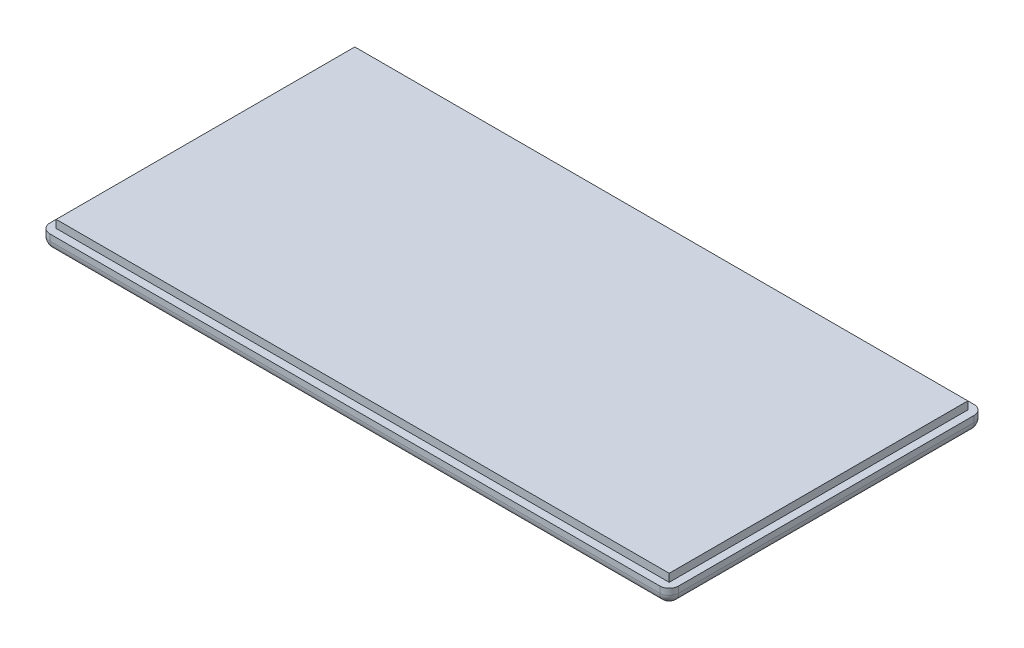
ISO-10303-21;
HEADER;
FILE_DESCRIPTION(('STEP AP214'),'2;1');
FILE_NAME('part.step','',(''),(''),'','','');
FILE_SCHEMA(('AUTOMOTIVE_DESIGN { 1 0 10303 214 1 1 1 1 }'));
ENDSEC;
DATA;
#1=APPLICATION_CONTEXT('core data for automotive mechanical design processes');
#2=APPLICATION_PROTOCOL_DEFINITION('international standard','automotive_design',2000,#1);
#3=PRODUCT_CONTEXT('',#1,'mechanical');
#4=PRODUCT('Part','Part','',(#3));
#5=PRODUCT_RELATED_PRODUCT_CATEGORY('part','',(#4));
#6=PRODUCT_DEFINITION_FORMATION('','',#4);
#7=PRODUCT_DEFINITION_CONTEXT('part definition',#1,'design');
#8=PRODUCT_DEFINITION('design','',#6,#7);
#9=PRODUCT_DEFINITION_SHAPE('','',#8);
#10=(LENGTH_UNIT() NAMED_UNIT(*) SI_UNIT(.MILLI.,.METRE.));
#11=(NAMED_UNIT(*) PLANE_ANGLE_UNIT() SI_UNIT($,.RADIAN.));
#12=(NAMED_UNIT(*) SI_UNIT($,.STERADIAN.) SOLID_ANGLE_UNIT());
#13=UNCERTAINTY_MEASURE_WITH_UNIT(LENGTH_MEASURE(1.E-05),#10,'distance_accuracy_value','');
#14=(GEOMETRIC_REPRESENTATION_CONTEXT(3) GLOBAL_UNCERTAINTY_ASSIGNED_CONTEXT((#13)) GLOBAL_UNIT_ASSIGNED_CONTEXT((#10,
#11,#12)) REPRESENTATION_CONTEXT('',''));
#15=CARTESIAN_POINT('',(0.,0.,0.));
#16=DIRECTION('',(0.,0.,1.));
#17=DIRECTION('',(1.,0.,0.));
#18=AXIS2_PLACEMENT_3D('',#15,#16,#17);
#19=CARTESIAN_POINT('',(0.,5.,0.));
#20=DIRECTION('',(1.,0.,0.));
#21=DIRECTION('',(0.,0.,-1.));
#22=AXIS2_PLACEMENT_3D('',#19,#20,#21);
#23=PLANE('',#22);
#24=DIRECTION('',(0.,-1.,0.));
#25=VECTOR('',#24,1.);
#26=CARTESIAN_POINT('',(0.,5.,3.));
#27=LINE('',#26,#25);
#28=CARTESIAN_POINT('',(0.,5.,3.));
#29=VERTEX_POINT('',#28);
#30=CARTESIAN_POINT('',(0.,3.,3.));
#31=VERTEX_POINT('',#30);
#32=EDGE_CURVE('E227',#29,#31,#27,.T.);
#33=ORIENTED_EDGE('',*,*,#32,.T.);
#34=DIRECTION('',(0.,0.,1.));
#35=VECTOR('',#34,1.);
#36=CARTESIAN_POINT('',(0.,3.,0.));
#37=LINE('',#36,#35);
#38=CARTESIAN_POINT('',(0.,3.,97.));
#39=VERTEX_POINT('',#38);
#40=EDGE_CURVE('E254',#31,#39,#37,.T.);
#41=ORIENTED_EDGE('',*,*,#40,.T.);
#42=DIRECTION('',(0.,-1.,0.));
#43=VECTOR('',#42,1.);
#44=CARTESIAN_POINT('',(0.,5.,97.));
#45=LINE('',#44,#43);
#46=CARTESIAN_POINT('',(0.,5.,97.));
#47=VERTEX_POINT('',#46);
#48=EDGE_CURVE('E224',#39,#47,#45,.F.);
#49=ORIENTED_EDGE('',*,*,#48,.T.);
#50=DIRECTION('',(0.,0.,1.));
#51=VECTOR('',#50,1.);
#52=CARTESIAN_POINT('',(0.,5.,0.));
#53=LINE('',#52,#51);
#54=EDGE_CURVE('E171',#29,#47,#53,.T.);
#55=ORIENTED_EDGE('',*,*,#54,.F.);
#56=EDGE_LOOP('',(#33,#41,#49,#55));
#57=FACE_BOUND('',#56,.T.);
#58=ADVANCED_FACE('F40',(#57),#23,.F.);
#59=CARTESIAN_POINT('',(0.,5.,100.));
#60=DIRECTION('',(0.,0.,-1.));
#61=DIRECTION('',(-1.,0.,0.));
#62=AXIS2_PLACEMENT_3D('',#59,#60,#61);
#63=PLANE('',#62);
#64=DIRECTION('',(0.,-1.,0.));
#65=VECTOR('',#64,1.);
#66=CARTESIAN_POINT('',(3.00000000000001,5.,100.));
#67=LINE('',#66,#65);
#68=CARTESIAN_POINT('',(3.00000000000001,5.,100.));
#69=VERTEX_POINT('',#68);
#70=CARTESIAN_POINT('',(3.00000000000001,3.,100.));
#71=VERTEX_POINT('',#70);
#72=EDGE_CURVE('E199',#69,#71,#67,.T.);
#73=ORIENTED_EDGE('',*,*,#72,.T.);
#74=DIRECTION('',(1.,0.,0.));
#75=VECTOR('',#74,1.);
#76=CARTESIAN_POINT('',(0.,3.,100.));
#77=LINE('',#76,#75);
#78=CARTESIAN_POINT('',(197.,3.,100.));
#79=VERTEX_POINT('',#78);
#80=EDGE_CURVE('E235',#71,#79,#77,.T.);
#81=ORIENTED_EDGE('',*,*,#80,.T.);
#82=DIRECTION('',(0.,-1.,0.));
#83=VECTOR('',#82,1.);
#84=CARTESIAN_POINT('',(197.,5.,100.));
#85=LINE('',#84,#83);
#86=CARTESIAN_POINT('',(197.,5.,100.));
#87=VERTEX_POINT('',#86);
#88=EDGE_CURVE('E203',#79,#87,#85,.F.);
#89=ORIENTED_EDGE('',*,*,#88,.T.);
#90=DIRECTION('',(1.,0.,0.));
#91=VECTOR('',#90,1.);
#92=CARTESIAN_POINT('',(0.,5.,100.));
#93=LINE('',#92,#91);
#94=EDGE_CURVE('E176',#69,#87,#93,.T.);
#95=ORIENTED_EDGE('',*,*,#94,.F.);
#96=EDGE_LOOP('',(#73,#81,#89,#95));
#97=FACE_BOUND('',#96,.T.);
#98=ADVANCED_FACE('F376',(#97),#63,.F.);
#99=CARTESIAN_POINT('',(200.,5.,0.));
#100=DIRECTION('',(-1.,0.,0.));
#101=DIRECTION('',(0.,0.,1.));
#102=AXIS2_PLACEMENT_3D('',#99,#100,#101);
#103=PLANE('',#102);
#104=DIRECTION('',(0.,-1.,0.));
#105=VECTOR('',#104,1.);
#106=CARTESIAN_POINT('',(200.,5.,97.));
#107=LINE('',#106,#105);
#108=CARTESIAN_POINT('',(200.,5.,97.));
#109=VERTEX_POINT('',#108);
#110=CARTESIAN_POINT('',(200.,3.,97.));
#111=VERTEX_POINT('',#110);
#112=EDGE_CURVE('E196',#109,#111,#107,.T.);
#113=ORIENTED_EDGE('',*,*,#112,.T.);
#114=DIRECTION('',(0.,0.,-1.));
#115=VECTOR('',#114,1.);
#116=CARTESIAN_POINT('',(200.,3.,0.));
#117=LINE('',#116,#115);
#118=CARTESIAN_POINT('',(200.,3.,3.));
#119=VERTEX_POINT('',#118);
#120=EDGE_CURVE('E11',#111,#119,#117,.T.);
#121=ORIENTED_EDGE('',*,*,#120,.T.);
#122=DIRECTION('',(0.,-1.,0.));
#123=VECTOR('',#122,1.);
#124=CARTESIAN_POINT('',(200.,5.,3.));
#125=LINE('',#124,#123);
#126=CARTESIAN_POINT('',(200.,5.,3.));
#127=VERTEX_POINT('',#126);
#128=EDGE_CURVE('E193',#119,#127,#125,.F.);
#129=ORIENTED_EDGE('',*,*,#128,.T.);
#130=DIRECTION('',(0.,0.,-1.));
#131=VECTOR('',#130,1.);
#132=CARTESIAN_POINT('',(200.,5.,0.));
#133=LINE('',#132,#131);
#134=EDGE_CURVE('E185',#109,#127,#133,.T.);
#135=ORIENTED_EDGE('',*,*,#134,.F.);
#136=EDGE_LOOP('',(#113,#121,#129,#135));
#137=FACE_BOUND('',#136,.T.);
#138=ADVANCED_FACE('F341',(#137),#103,.F.);
#139=CARTESIAN_POINT('',(0.,5.,0.));
#140=DIRECTION('',(0.,0.,1.));
#141=DIRECTION('',(1.,0.,0.));
#142=AXIS2_PLACEMENT_3D('',#139,#140,#141);
#143=PLANE('',#142);
#144=DIRECTION('',(0.,-1.,0.));
#145=VECTOR('',#144,1.);
#146=CARTESIAN_POINT('',(197.,5.,0.));
#147=LINE('',#146,#145);
#148=CARTESIAN_POINT('',(197.,5.,0.));
#149=VERTEX_POINT('',#148);
#150=CARTESIAN_POINT('',(197.,3.,0.));
#151=VERTEX_POINT('',#150);
#152=EDGE_CURVE('E221',#149,#151,#147,.T.);
#153=ORIENTED_EDGE('',*,*,#152,.T.);
#154=DIRECTION('',(-1.,0.,0.));
#155=VECTOR('',#154,1.);
#156=CARTESIAN_POINT('',(0.,3.,0.));
#157=LINE('',#156,#155);
#158=CARTESIAN_POINT('',(3.,3.,0.));
#159=VERTEX_POINT('',#158);
#160=EDGE_CURVE('E260',#151,#159,#157,.T.);
#161=ORIENTED_EDGE('',*,*,#160,.T.);
#162=DIRECTION('',(0.,-1.,0.));
#163=VECTOR('',#162,1.);
#164=CARTESIAN_POINT('',(3.,5.,0.));
#165=LINE('',#164,#163);
#166=CARTESIAN_POINT('',(3.,5.,0.));
#167=VERTEX_POINT('',#166);
#168=EDGE_CURVE('E218',#159,#167,#165,.F.);
#169=ORIENTED_EDGE('',*,*,#168,.T.);
#170=DIRECTION('',(-1.,0.,0.));
#171=VECTOR('',#170,1.);
#172=CARTESIAN_POINT('',(0.,5.,0.));
#173=LINE('',#172,#171);
#174=EDGE_CURVE('E189',#149,#167,#173,.T.);
#175=ORIENTED_EDGE('',*,*,#174,.F.);
#176=EDGE_LOOP('',(#153,#161,#169,#175));
#177=FACE_BOUND('',#176,.T.);
#178=ADVANCED_FACE('F328',(#177),#143,.F.);
#179=CARTESIAN_POINT('',(0.,5.,0.));
#180=DIRECTION('',(0.,1.,0.));
#181=DIRECTION('',(0.,0.,1.));
#182=AXIS2_PLACEMENT_3D('',#179,#180,#181);
#183=PLANE('',#182);
#184=DIRECTION('',(0.,0.,1.));
#185=VECTOR('',#184,1.);
#186=CARTESIAN_POINT('',(2.5,5.,2.5));
#187=LINE('',#186,#185);
#188=CARTESIAN_POINT('',(2.5,5.,2.5));
#189=VERTEX_POINT('',#188);
#190=CARTESIAN_POINT('',(2.5,5.,97.5));
#191=VERTEX_POINT('',#190);
#192=EDGE_CURVE('E169',#189,#191,#187,.T.);
#193=ORIENTED_EDGE('',*,*,#192,.F.);
#194=DIRECTION('',(-1.,0.,0.));
#195=VECTOR('',#194,1.);
#196=CARTESIAN_POINT('',(2.5,5.,2.5));
#197=LINE('',#196,#195);
#198=CARTESIAN_POINT('',(197.5,5.,2.5));
#199=VERTEX_POINT('',#198);
#200=EDGE_CURVE('E166',#199,#189,#197,.T.);
#201=ORIENTED_EDGE('',*,*,#200,.F.);
#202=DIRECTION('',(0.,0.,-1.));
#203=VECTOR('',#202,1.);
#204=CARTESIAN_POINT('',(197.5,5.,2.5));
#205=LINE('',#204,#203);
#206=CARTESIAN_POINT('',(197.5,5.,97.5));
#207=VERTEX_POINT('',#206);
#208=EDGE_CURVE('E303',#207,#199,#205,.T.);
#209=ORIENTED_EDGE('',*,*,#208,.F.);
#210=DIRECTION('',(1.,0.,0.));
#211=VECTOR('',#210,1.);
#212=CARTESIAN_POINT('',(2.5,5.,97.5));
#213=LINE('',#212,#211);
#214=EDGE_CURVE('E300',#191,#207,#213,.T.);
#215=ORIENTED_EDGE('',*,*,#214,.F.);
#216=EDGE_LOOP('',(#193,#201,#209,#215));
#217=FACE_BOUND('',#216,.T.);
#218=ORIENTED_EDGE('',*,*,#94,.T.);
#219=CARTESIAN_POINT('',(197.,5.,97.));
#220=DIRECTION('',(0.,1.,0.));
#221=DIRECTION('',(0.,0.,1.));
#222=AXIS2_PLACEMENT_3D('',#219,#220,#221);
#223=CIRCLE('',#222,3.);
#224=EDGE_CURVE('E215',#87,#109,#223,.T.);
#225=ORIENTED_EDGE('',*,*,#224,.T.);
#226=ORIENTED_EDGE('',*,*,#134,.T.);
#227=CARTESIAN_POINT('',(197.,5.,3.));
#228=DIRECTION('',(0.,1.,0.));
#229=DIRECTION('',(0.,0.,1.));
#230=AXIS2_PLACEMENT_3D('',#227,#228,#229);
#231=CIRCLE('',#230,3.);
#232=EDGE_CURVE('E212',#127,#149,#231,.T.);
#233=ORIENTED_EDGE('',*,*,#232,.T.);
#234=ORIENTED_EDGE('',*,*,#174,.T.);
#235=CARTESIAN_POINT('',(3.,5.,3.));
#236=DIRECTION('',(0.,1.,0.));
#237=DIRECTION('',(0.,0.,1.));
#238=AXIS2_PLACEMENT_3D('',#235,#236,#237);
#239=CIRCLE('',#238,3.);
#240=EDGE_CURVE('E209',#167,#29,#239,.T.);
#241=ORIENTED_EDGE('',*,*,#240,.T.);
#242=ORIENTED_EDGE('',*,*,#54,.T.);
#243=CARTESIAN_POINT('',(3.00000000000001,5.,97.));
#244=DIRECTION('',(0.,1.,0.));
#245=DIRECTION('',(0.,0.,1.));
#246=AXIS2_PLACEMENT_3D('',#243,#244,#245);
#247=CIRCLE('',#246,3.);
#248=EDGE_CURVE('E206',#47,#69,#247,.T.);
#249=ORIENTED_EDGE('',*,*,#248,.T.);
#250=EDGE_LOOP('',(#218,#225,#226,#233,#234,#241,#242,#249));
#251=FACE_BOUND('',#250,.T.);
#252=ADVANCED_FACE('F324',(#217,#251),#183,.T.);
#253=CARTESIAN_POINT('',(0.,0.,0.));
#254=DIRECTION('',(0.,1.,0.));
#255=DIRECTION('',(0.,0.,1.));
#256=AXIS2_PLACEMENT_3D('',#253,#254,#255);
#257=PLANE('',#256);
#258=DIRECTION('',(0.,0.,-1.));
#259=VECTOR('',#258,1.);
#260=CARTESIAN_POINT('',(197.,0.,0.));
#261=LINE('',#260,#259);
#262=CARTESIAN_POINT('',(197.,0.,3.));
#263=VERTEX_POINT('',#262);
#264=CARTESIAN_POINT('',(197.,0.,97.));
#265=VERTEX_POINT('',#264);
#266=EDGE_CURVE('E238',#263,#265,#261,.F.);
#267=ORIENTED_EDGE('',*,*,#266,.T.);
#268=DIRECTION('',(1.,0.,0.));
#269=VECTOR('',#268,1.);
#270=CARTESIAN_POINT('',(0.,0.,97.));
#271=LINE('',#270,#269);
#272=CARTESIAN_POINT('',(3.00000000000001,0.,97.));
#273=VERTEX_POINT('',#272);
#274=EDGE_CURVE('E247',#265,#273,#271,.F.);
#275=ORIENTED_EDGE('',*,*,#274,.T.);
#276=DIRECTION('',(0.,0.,1.));
#277=VECTOR('',#276,1.);
#278=CARTESIAN_POINT('',(3.,0.,0.));
#279=LINE('',#278,#277);
#280=CARTESIAN_POINT('',(3.,0.,3.));
#281=VERTEX_POINT('',#280);
#282=EDGE_CURVE('E244',#273,#281,#279,.F.);
#283=ORIENTED_EDGE('',*,*,#282,.T.);
#284=DIRECTION('',(-1.,0.,0.));
#285=VECTOR('',#284,1.);
#286=CARTESIAN_POINT('',(0.,0.,3.));
#287=LINE('',#286,#285);
#288=EDGE_CURVE('E241',#281,#263,#287,.F.);
#289=ORIENTED_EDGE('',*,*,#288,.T.);
#290=EDGE_LOOP('',(#267,#275,#283,#289));
#291=FACE_BOUND('',#290,.T.);
#292=ADVANCED_FACE('F327',(#291),#257,.F.);
#293=CARTESIAN_POINT('',(2.5,7.5,2.5));
#294=DIRECTION('',(1.,0.,0.));
#295=DIRECTION('',(0.,0.,-1.));
#296=AXIS2_PLACEMENT_3D('',#293,#294,#295);
#297=PLANE('',#296);
#298=ORIENTED_EDGE('',*,*,#192,.T.);
#299=DIRECTION('',(0.,-1.,0.));
#300=VECTOR('',#299,1.);
#301=CARTESIAN_POINT('',(2.5,7.5,97.5));
#302=LINE('',#301,#300);
#303=CARTESIAN_POINT('',(2.5,7.5,97.5));
#304=VERTEX_POINT('',#303);
#305=EDGE_CURVE('E148',#304,#191,#302,.T.);
#306=ORIENTED_EDGE('',*,*,#305,.F.);
#307=DIRECTION('',(0.,0.,1.));
#308=VECTOR('',#307,1.);
#309=CARTESIAN_POINT('',(2.5,7.5,2.5));
#310=LINE('',#309,#308);
#311=CARTESIAN_POINT('',(2.5,7.5,2.5));
#312=VERTEX_POINT('',#311);
#313=EDGE_CURVE('E156',#312,#304,#310,.T.);
#314=ORIENTED_EDGE('',*,*,#313,.F.);
#315=DIRECTION('',(0.,-1.,0.));
#316=VECTOR('',#315,1.);
#317=CARTESIAN_POINT('',(2.5,7.5,2.5));
#318=LINE('',#317,#316);
#319=EDGE_CURVE('E314',#312,#189,#318,.T.);
#320=ORIENTED_EDGE('',*,*,#319,.T.);
#321=EDGE_LOOP('',(#298,#306,#314,#320));
#322=FACE_BOUND('',#321,.T.);
#323=ADVANCED_FACE('F168',(#322),#297,.F.);
#324=CARTESIAN_POINT('',(2.5,7.5,97.5));
#325=DIRECTION('',(0.,0.,-1.));
#326=DIRECTION('',(-1.,0.,0.));
#327=AXIS2_PLACEMENT_3D('',#324,#325,#326);
#328=PLANE('',#327);
#329=ORIENTED_EDGE('',*,*,#214,.T.);
#330=DIRECTION('',(0.,-1.,0.));
#331=VECTOR('',#330,1.);
#332=CARTESIAN_POINT('',(197.5,7.5,97.5));
#333=LINE('',#332,#331);
#334=CARTESIAN_POINT('',(197.5,7.5,97.5));
#335=VERTEX_POINT('',#334);
#336=EDGE_CURVE('E151',#335,#207,#333,.T.);
#337=ORIENTED_EDGE('',*,*,#336,.F.);
#338=DIRECTION('',(1.,0.,0.));
#339=VECTOR('',#338,1.);
#340=CARTESIAN_POINT('',(2.5,7.5,97.5));
#341=LINE('',#340,#339);
#342=EDGE_CURVE('E143',#304,#335,#341,.T.);
#343=ORIENTED_EDGE('',*,*,#342,.F.);
#344=ORIENTED_EDGE('',*,*,#305,.T.);
#345=EDGE_LOOP('',(#329,#337,#343,#344));
#346=FACE_BOUND('',#345,.T.);
#347=ADVANCED_FACE('F146',(#346),#328,.F.);
#348=CARTESIAN_POINT('',(197.5,7.5,2.5));
#349=DIRECTION('',(-1.,0.,0.));
#350=DIRECTION('',(0.,0.,1.));
#351=AXIS2_PLACEMENT_3D('',#348,#349,#350);
#352=PLANE('',#351);
#353=ORIENTED_EDGE('',*,*,#208,.T.);
#354=DIRECTION('',(0.,-1.,0.));
#355=VECTOR('',#354,1.);
#356=CARTESIAN_POINT('',(197.5,7.5,2.5));
#357=LINE('',#356,#355);
#358=CARTESIAN_POINT('',(197.5,7.5,2.5));
#359=VERTEX_POINT('',#358);
#360=EDGE_CURVE('E178',#359,#199,#357,.T.);
#361=ORIENTED_EDGE('',*,*,#360,.F.);
#362=DIRECTION('',(0.,0.,-1.));
#363=VECTOR('',#362,1.);
#364=CARTESIAN_POINT('',(197.5,7.5,2.5));
#365=LINE('',#364,#363);
#366=EDGE_CURVE('E155',#335,#359,#365,.T.);
#367=ORIENTED_EDGE('',*,*,#366,.F.);
#368=ORIENTED_EDGE('',*,*,#336,.T.);
#369=EDGE_LOOP('',(#353,#361,#367,#368));
#370=FACE_BOUND('',#369,.T.);
#371=ADVANCED_FACE('F322',(#370),#352,.F.);
#372=CARTESIAN_POINT('',(2.5,7.5,2.5));
#373=DIRECTION('',(0.,0.,1.));
#374=DIRECTION('',(1.,0.,0.));
#375=AXIS2_PLACEMENT_3D('',#372,#373,#374);
#376=PLANE('',#375);
#377=ORIENTED_EDGE('',*,*,#200,.T.);
#378=ORIENTED_EDGE('',*,*,#319,.F.);
#379=DIRECTION('',(-1.,0.,0.));
#380=VECTOR('',#379,1.);
#381=CARTESIAN_POINT('',(2.5,7.5,2.5));
#382=LINE('',#381,#380);
#383=EDGE_CURVE('E161',#359,#312,#382,.T.);
#384=ORIENTED_EDGE('',*,*,#383,.F.);
#385=ORIENTED_EDGE('',*,*,#360,.T.);
#386=EDGE_LOOP('',(#377,#378,#384,#385));
#387=FACE_BOUND('',#386,.T.);
#388=ADVANCED_FACE('F320',(#387),#376,.F.);
#389=CARTESIAN_POINT('',(0.,7.5,0.));
#390=DIRECTION('',(0.,1.,0.));
#391=DIRECTION('',(0.,0.,1.));
#392=AXIS2_PLACEMENT_3D('',#389,#390,#391);
#393=PLANE('',#392);
#394=ORIENTED_EDGE('',*,*,#313,.T.);
#395=ORIENTED_EDGE('',*,*,#342,.T.);
#396=ORIENTED_EDGE('',*,*,#366,.T.);
#397=ORIENTED_EDGE('',*,*,#383,.T.);
#398=EDGE_LOOP('',(#394,#395,#396,#397));
#399=FACE_BOUND('',#398,.T.);
#400=ADVANCED_FACE('F159',(#399),#393,.T.);
#401=CARTESIAN_POINT('',(197.,5.,97.));
#402=DIRECTION('',(0.,-1.,0.));
#403=DIRECTION('',(0.,0.,-1.));
#404=AXIS2_PLACEMENT_3D('',#401,#402,#403);
#405=CYLINDRICAL_SURFACE('',#404,3.);
#406=ORIENTED_EDGE('',*,*,#88,.F.);
#407=CARTESIAN_POINT('',(197.,3.,97.));
#408=DIRECTION('',(0.,-1.,0.));
#409=DIRECTION('',(0.,0.,-1.));
#410=AXIS2_PLACEMENT_3D('',#407,#408,#409);
#411=CIRCLE('',#410,3.);
#412=EDGE_CURVE('E231',#79,#111,#411,.F.);
#413=ORIENTED_EDGE('',*,*,#412,.T.);
#414=ORIENTED_EDGE('',*,*,#112,.F.);
#415=ORIENTED_EDGE('',*,*,#224,.F.);
#416=EDGE_LOOP('',(#406,#413,#414,#415));
#417=FACE_BOUND('',#416,.T.);
#418=ADVANCED_FACE('F339',(#417),#405,.T.);
#419=CARTESIAN_POINT('',(197.,5.,3.));
#420=DIRECTION('',(0.,-1.,0.));
#421=DIRECTION('',(0.,0.,-1.));
#422=AXIS2_PLACEMENT_3D('',#419,#420,#421);
#423=CYLINDRICAL_SURFACE('',#422,3.);
#424=ORIENTED_EDGE('',*,*,#128,.F.);
#425=CARTESIAN_POINT('',(197.,3.,3.));
#426=DIRECTION('',(0.,-1.,0.));
#427=DIRECTION('',(0.,0.,-1.));
#428=AXIS2_PLACEMENT_3D('',#425,#426,#427);
#429=CIRCLE('',#428,3.);
#430=EDGE_CURVE('E50',#119,#151,#429,.F.);
#431=ORIENTED_EDGE('',*,*,#430,.T.);
#432=ORIENTED_EDGE('',*,*,#152,.F.);
#433=ORIENTED_EDGE('',*,*,#232,.F.);
#434=EDGE_LOOP('',(#424,#431,#432,#433));
#435=FACE_BOUND('',#434,.T.);
#436=ADVANCED_FACE('F344',(#435),#423,.T.);
#437=CARTESIAN_POINT('',(3.,5.,3.));
#438=DIRECTION('',(0.,-1.,0.));
#439=DIRECTION('',(0.,0.,-1.));
#440=AXIS2_PLACEMENT_3D('',#437,#438,#439);
#441=CYLINDRICAL_SURFACE('',#440,3.);
#442=ORIENTED_EDGE('',*,*,#168,.F.);
#443=CARTESIAN_POINT('',(3.,3.,3.));
#444=DIRECTION('',(0.,-1.,0.));
#445=DIRECTION('',(0.,0.,-1.));
#446=AXIS2_PLACEMENT_3D('',#443,#444,#445);
#447=CIRCLE('',#446,3.);
#448=EDGE_CURVE('E257',#159,#31,#447,.F.);
#449=ORIENTED_EDGE('',*,*,#448,.T.);
#450=ORIENTED_EDGE('',*,*,#32,.F.);
#451=ORIENTED_EDGE('',*,*,#240,.F.);
#452=EDGE_LOOP('',(#442,#449,#450,#451));
#453=FACE_BOUND('',#452,.T.);
#454=ADVANCED_FACE('F389',(#453),#441,.T.);
#455=CARTESIAN_POINT('',(3.00000000000001,5.,97.));
#456=DIRECTION('',(0.,-1.,0.));
#457=DIRECTION('',(0.,0.,-1.));
#458=AXIS2_PLACEMENT_3D('',#455,#456,#457);
#459=CYLINDRICAL_SURFACE('',#458,3.);
#460=ORIENTED_EDGE('',*,*,#48,.F.);
#461=CARTESIAN_POINT('',(3.00000000000001,3.,97.));
#462=DIRECTION('',(0.,-1.,0.));
#463=DIRECTION('',(0.,0.,-1.));
#464=AXIS2_PLACEMENT_3D('',#461,#462,#463);
#465=CIRCLE('',#464,3.);
#466=EDGE_CURVE('E251',#39,#71,#465,.F.);
#467=ORIENTED_EDGE('',*,*,#466,.T.);
#468=ORIENTED_EDGE('',*,*,#72,.F.);
#469=ORIENTED_EDGE('',*,*,#248,.F.);
#470=EDGE_LOOP('',(#460,#467,#468,#469));
#471=FACE_BOUND('',#470,.T.);
#472=ADVANCED_FACE('F392',(#471),#459,.T.);
#473=CARTESIAN_POINT('',(3.,3.,3.));
#474=DIRECTION('',(0.,1.,0.));
#475=DIRECTION('',(0.,0.,1.));
#476=AXIS2_PLACEMENT_3D('',#473,#474,#475);
#477=SPHERICAL_SURFACE('',#476,3.);
#478=CARTESIAN_POINT('',(3.,3.,3.));
#479=DIRECTION('',(0.,0.,1.));
#480=DIRECTION('',(1.,0.,0.));
#481=AXIS2_PLACEMENT_3D('',#478,#479,#480);
#482=CIRCLE('',#481,3.);
#483=EDGE_CURVE('E286',#31,#281,#482,.T.);
#484=ORIENTED_EDGE('',*,*,#483,.F.);
#485=ORIENTED_EDGE('',*,*,#448,.F.);
#486=CARTESIAN_POINT('',(3.,3.,3.));
#487=DIRECTION('',(1.,0.,0.));
#488=DIRECTION('',(0.,0.,-1.));
#489=AXIS2_PLACEMENT_3D('',#486,#487,#488);
#490=CIRCLE('',#489,3.);
#491=EDGE_CURVE('E44',#281,#159,#490,.T.);
#492=ORIENTED_EDGE('',*,*,#491,.F.);
#493=EDGE_LOOP('',(#484,#485,#492));
#494=FACE_BOUND('',#493,.T.);
#495=ADVANCED_FACE('F42',(#494),#477,.T.);
#496=CARTESIAN_POINT('',(0.,3.,3.));
#497=DIRECTION('',(-1.,0.,0.));
#498=DIRECTION('',(0.,0.,1.));
#499=AXIS2_PLACEMENT_3D('',#496,#497,#498);
#500=CYLINDRICAL_SURFACE('',#499,3.);
#501=ORIENTED_EDGE('',*,*,#491,.T.);
#502=ORIENTED_EDGE('',*,*,#160,.F.);
#503=CARTESIAN_POINT('',(197.,3.,3.));
#504=DIRECTION('',(1.,0.,0.));
#505=DIRECTION('',(0.,0.,-1.));
#506=AXIS2_PLACEMENT_3D('',#503,#504,#505);
#507=CIRCLE('',#506,3.);
#508=EDGE_CURVE('E283',#263,#151,#507,.T.);
#509=ORIENTED_EDGE('',*,*,#508,.F.);
#510=ORIENTED_EDGE('',*,*,#288,.F.);
#511=EDGE_LOOP('',(#501,#502,#509,#510));
#512=FACE_BOUND('',#511,.T.);
#513=ADVANCED_FACE('F348',(#512),#500,.T.);
#514=CARTESIAN_POINT('',(3.,3.,0.));
#515=DIRECTION('',(0.,0.,1.));
#516=DIRECTION('',(1.,0.,0.));
#517=AXIS2_PLACEMENT_3D('',#514,#515,#516);
#518=CYLINDRICAL_SURFACE('',#517,3.);
#519=ORIENTED_EDGE('',*,*,#483,.T.);
#520=ORIENTED_EDGE('',*,*,#282,.F.);
#521=CARTESIAN_POINT('',(3.00000000000001,3.,97.));
#522=DIRECTION('',(0.,0.,1.));
#523=DIRECTION('',(1.,0.,0.));
#524=AXIS2_PLACEMENT_3D('',#521,#522,#523);
#525=CIRCLE('',#524,3.);
#526=EDGE_CURVE('E279',#39,#273,#525,.T.);
#527=ORIENTED_EDGE('',*,*,#526,.F.);
#528=ORIENTED_EDGE('',*,*,#40,.F.);
#529=EDGE_LOOP('',(#519,#520,#527,#528));
#530=FACE_BOUND('',#529,.T.);
#531=ADVANCED_FACE('F367',(#530),#518,.T.);
#532=CARTESIAN_POINT('',(197.,3.,3.));
#533=DIRECTION('',(0.,1.,0.));
#534=DIRECTION('',(0.,0.,1.));
#535=AXIS2_PLACEMENT_3D('',#532,#533,#534);
#536=SPHERICAL_SURFACE('',#535,3.);
#537=ORIENTED_EDGE('',*,*,#508,.T.);
#538=ORIENTED_EDGE('',*,*,#430,.F.);
#539=CARTESIAN_POINT('',(197.,3.,3.));
#540=DIRECTION('',(0.,0.,1.));
#541=DIRECTION('',(1.,0.,0.));
#542=AXIS2_PLACEMENT_3D('',#539,#540,#541);
#543=CIRCLE('',#542,3.);
#544=EDGE_CURVE('E275',#263,#119,#543,.T.);
#545=ORIENTED_EDGE('',*,*,#544,.F.);
#546=EDGE_LOOP('',(#537,#538,#545));
#547=FACE_BOUND('',#546,.T.);
#548=ADVANCED_FACE('F351',(#547),#536,.T.);
#549=CARTESIAN_POINT('',(3.00000000000001,3.,97.));
#550=DIRECTION('',(0.,1.,0.));
#551=DIRECTION('',(0.,0.,1.));
#552=AXIS2_PLACEMENT_3D('',#549,#550,#551);
#553=SPHERICAL_SURFACE('',#552,3.);
#554=ORIENTED_EDGE('',*,*,#466,.F.);
#555=ORIENTED_EDGE('',*,*,#526,.T.);
#556=CARTESIAN_POINT('',(3.00000000000001,3.,97.));
#557=DIRECTION('',(1.,0.,0.));
#558=DIRECTION('',(0.,0.,-1.));
#559=AXIS2_PLACEMENT_3D('',#556,#557,#558);
#560=CIRCLE('',#559,3.);
#561=EDGE_CURVE('E272',#71,#273,#560,.T.);
#562=ORIENTED_EDGE('',*,*,#561,.F.);
#563=EDGE_LOOP('',(#554,#555,#562));
#564=FACE_BOUND('',#563,.T.);
#565=ADVANCED_FACE('F366',(#564),#553,.T.);
#566=CARTESIAN_POINT('',(197.,3.,0.));
#567=DIRECTION('',(0.,0.,-1.));
#568=DIRECTION('',(-1.,0.,0.));
#569=AXIS2_PLACEMENT_3D('',#566,#567,#568);
#570=CYLINDRICAL_SURFACE('',#569,3.);
#571=ORIENTED_EDGE('',*,*,#544,.T.);
#572=ORIENTED_EDGE('',*,*,#120,.F.);
#573=CARTESIAN_POINT('',(197.,3.,97.));
#574=DIRECTION('',(0.,0.,1.));
#575=DIRECTION('',(1.,0.,0.));
#576=AXIS2_PLACEMENT_3D('',#573,#574,#575);
#577=CIRCLE('',#576,3.);
#578=EDGE_CURVE('E269',#265,#111,#577,.T.);
#579=ORIENTED_EDGE('',*,*,#578,.F.);
#580=ORIENTED_EDGE('',*,*,#266,.F.);
#581=EDGE_LOOP('',(#571,#572,#579,#580));
#582=FACE_BOUND('',#581,.T.);
#583=ADVANCED_FACE('F355',(#582),#570,.T.);
#584=CARTESIAN_POINT('',(0.,3.,97.));
#585=DIRECTION('',(1.,0.,0.));
#586=DIRECTION('',(0.,0.,-1.));
#587=AXIS2_PLACEMENT_3D('',#584,#585,#586);
#588=CYLINDRICAL_SURFACE('',#587,3.);
#589=ORIENTED_EDGE('',*,*,#561,.T.);
#590=ORIENTED_EDGE('',*,*,#274,.F.);
#591=CARTESIAN_POINT('',(197.,3.,97.));
#592=DIRECTION('',(1.,0.,0.));
#593=DIRECTION('',(0.,0.,-1.));
#594=AXIS2_PLACEMENT_3D('',#591,#592,#593);
#595=CIRCLE('',#594,3.);
#596=EDGE_CURVE('E265',#79,#265,#595,.T.);
#597=ORIENTED_EDGE('',*,*,#596,.F.);
#598=ORIENTED_EDGE('',*,*,#80,.F.);
#599=EDGE_LOOP('',(#589,#590,#597,#598));
#600=FACE_BOUND('',#599,.T.);
#601=ADVANCED_FACE('F360',(#600),#588,.T.);
#602=CARTESIAN_POINT('',(197.,3.,97.));
#603=DIRECTION('',(0.,1.,0.));
#604=DIRECTION('',(0.,0.,1.));
#605=AXIS2_PLACEMENT_3D('',#602,#603,#604);
#606=SPHERICAL_SURFACE('',#605,3.);
#607=ORIENTED_EDGE('',*,*,#578,.T.);
#608=ORIENTED_EDGE('',*,*,#412,.F.);
#609=ORIENTED_EDGE('',*,*,#596,.T.);
#610=EDGE_LOOP('',(#607,#608,#609));
#611=FACE_BOUND('',#610,.T.);
#612=ADVANCED_FACE('F397',(#611),#606,.T.);
#613=CLOSED_SHELL('',(#58,#98,#138,#178,#252,#292,#323,#347,#371,#388,#400,#418,#436,#454,#472,
#495,#513,#531,#548,#565,#583,#601,#612));
#614=MANIFOLD_SOLID_BREP('B2',#613);
#615=ADVANCED_BREP_SHAPE_REPRESENTATION('',(#18,#614),#14);
#616=SHAPE_DEFINITION_REPRESENTATION(#9,#615);
ENDSEC;
END-ISO-10303-21;
